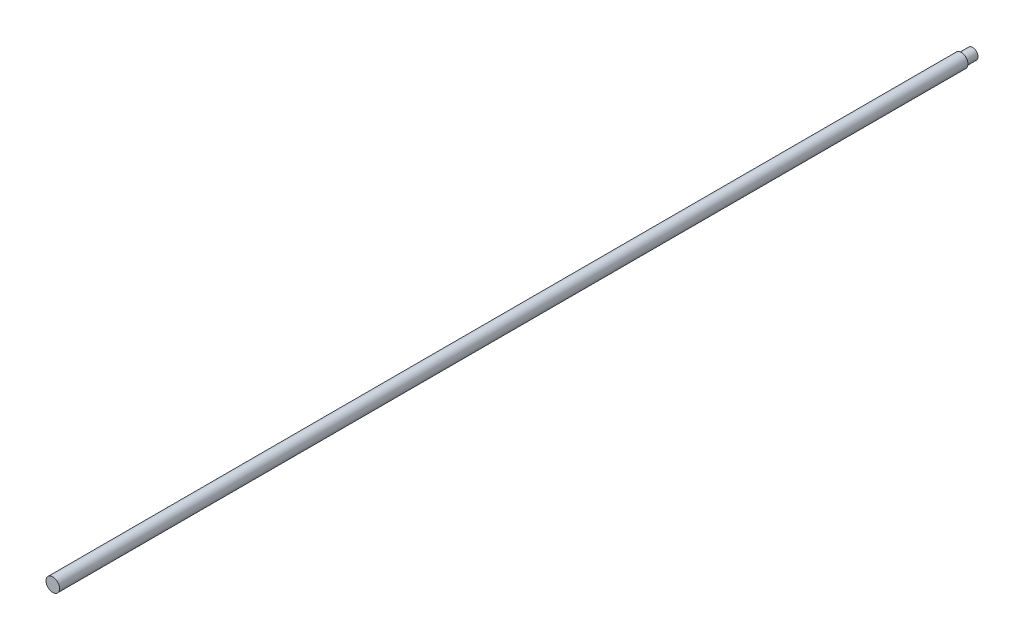
ISO-10303-21;
HEADER;
FILE_DESCRIPTION(('STEP AP214'),'2;1');
FILE_NAME('part.step','',(''),(''),'','','');
FILE_SCHEMA(('AUTOMOTIVE_DESIGN { 1 0 10303 214 1 1 1 1 }'));
ENDSEC;
DATA;
#1=APPLICATION_CONTEXT('core data for automotive mechanical design processes');
#2=APPLICATION_PROTOCOL_DEFINITION('international standard','automotive_design',2000,#1);
#3=PRODUCT_CONTEXT('',#1,'mechanical');
#4=PRODUCT('Part','Part','',(#3));
#5=PRODUCT_RELATED_PRODUCT_CATEGORY('part','',(#4));
#6=PRODUCT_DEFINITION_FORMATION('','',#4);
#7=PRODUCT_DEFINITION_CONTEXT('part definition',#1,'design');
#8=PRODUCT_DEFINITION('design','',#6,#7);
#9=PRODUCT_DEFINITION_SHAPE('','',#8);
#10=(LENGTH_UNIT() NAMED_UNIT(*) SI_UNIT(.MILLI.,.METRE.));
#11=(NAMED_UNIT(*) PLANE_ANGLE_UNIT() SI_UNIT($,.RADIAN.));
#12=(NAMED_UNIT(*) SI_UNIT($,.STERADIAN.) SOLID_ANGLE_UNIT());
#13=UNCERTAINTY_MEASURE_WITH_UNIT(LENGTH_MEASURE(1.E-05),#10,'distance_accuracy_value','');
#14=(GEOMETRIC_REPRESENTATION_CONTEXT(3) GLOBAL_UNCERTAINTY_ASSIGNED_CONTEXT((#13)) GLOBAL_UNIT_ASSIGNED_CONTEXT((#10,
#11,#12)) REPRESENTATION_CONTEXT('',''));
#15=CARTESIAN_POINT('',(0.,0.,0.));
#16=DIRECTION('',(0.,0.,1.));
#17=DIRECTION('',(1.,0.,0.));
#18=AXIS2_PLACEMENT_3D('',#15,#16,#17);
#19=CARTESIAN_POINT('',(0.,0.,340.));
#20=DIRECTION('',(0.,0.,-1.));
#21=DIRECTION('',(-1.,0.,0.));
#22=AXIS2_PLACEMENT_3D('',#19,#20,#21);
#23=CYLINDRICAL_SURFACE('',#22,2.5);
#24=CARTESIAN_POINT('',(0.,0.,340.));
#25=DIRECTION('',(0.,0.,1.));
#26=DIRECTION('',(1.,0.,0.));
#27=AXIS2_PLACEMENT_3D('',#24,#25,#26);
#28=CIRCLE('',#27,2.5);
#29=CARTESIAN_POINT('',(2.5,0.,340.));
#30=VERTEX_POINT('',#29);
#31=EDGE_CURVE('E12',#30,#30,#28,.T.);
#32=ORIENTED_EDGE('',*,*,#31,.F.);
#33=EDGE_LOOP('',(#32));
#34=FACE_BOUND('',#33,.T.);
#35=CARTESIAN_POINT('',(0.,0.,4.19999999999998));
#36=DIRECTION('',(0.,0.,-1.));
#37=DIRECTION('',(-1.,0.,0.));
#38=AXIS2_PLACEMENT_3D('',#35,#36,#37);
#39=CIRCLE('',#38,2.5);
#40=CARTESIAN_POINT('',(-2.5,0.,4.19999999999998));
#41=VERTEX_POINT('',#40);
#42=EDGE_CURVE('E44',#41,#41,#39,.T.);
#43=ORIENTED_EDGE('',*,*,#42,.F.);
#44=EDGE_LOOP('',(#43));
#45=FACE_BOUND('',#44,.T.);
#46=ADVANCED_FACE('F41',(#34,#45),#23,.T.);
#47=CARTESIAN_POINT('',(0.,0.,340.));
#48=DIRECTION('',(0.,0.,1.));
#49=DIRECTION('',(1.,0.,0.));
#50=AXIS2_PLACEMENT_3D('',#47,#48,#49);
#51=PLANE('',#50);
#52=ORIENTED_EDGE('',*,*,#31,.T.);
#53=EDGE_LOOP('',(#52));
#54=FACE_BOUND('',#53,.T.);
#55=ADVANCED_FACE('F78',(#54),#51,.T.);
#56=CARTESIAN_POINT('',(0.,0.,4.2));
#57=DIRECTION('',(0.,0.,-1.));
#58=DIRECTION('',(-1.,0.,0.));
#59=AXIS2_PLACEMENT_3D('',#56,#57,#58);
#60=PLANE('',#59);
#61=CARTESIAN_POINT('',(0.,0.,4.2));
#62=DIRECTION('',(0.,0.,-1.));
#63=DIRECTION('',(-1.,0.,0.));
#64=AXIS2_PLACEMENT_3D('',#61,#62,#63);
#65=CIRCLE('',#64,2.);
#66=CARTESIAN_POINT('',(-2.,0.,4.2));
#67=VERTEX_POINT('',#66);
#68=EDGE_CURVE('E64',#67,#67,#65,.T.);
#69=ORIENTED_EDGE('',*,*,#68,.F.);
#70=EDGE_LOOP('',(#69));
#71=FACE_BOUND('',#70,.T.);
#72=ORIENTED_EDGE('',*,*,#42,.T.);
#73=EDGE_LOOP('',(#72));
#74=FACE_BOUND('',#73,.T.);
#75=ADVANCED_FACE('F75',(#71,#74),#60,.T.);
#76=CARTESIAN_POINT('',(0.,0.,4.2));
#77=DIRECTION('',(0.,0.,-1.));
#78=DIRECTION('',(-1.,0.,0.));
#79=AXIS2_PLACEMENT_3D('',#76,#77,#78);
#80=CYLINDRICAL_SURFACE('',#79,2.);
#81=ORIENTED_EDGE('',*,*,#68,.T.);
#82=EDGE_LOOP('',(#81));
#83=FACE_BOUND('',#82,.T.);
#84=CARTESIAN_POINT('',(0.,0.,0.));
#85=DIRECTION('',(0.,0.,-1.));
#86=DIRECTION('',(-1.,0.,0.));
#87=AXIS2_PLACEMENT_3D('',#84,#85,#86);
#88=CIRCLE('',#87,2.);
#89=CARTESIAN_POINT('',(-2.,0.,0.));
#90=VERTEX_POINT('',#89);
#91=EDGE_CURVE('E60',#90,#90,#88,.T.);
#92=ORIENTED_EDGE('',*,*,#91,.F.);
#93=EDGE_LOOP('',(#92));
#94=FACE_BOUND('',#93,.T.);
#95=ADVANCED_FACE('F89',(#83,#94),#80,.T.);
#96=CARTESIAN_POINT('',(0.,0.,0.));
#97=DIRECTION('',(0.,0.,1.));
#98=DIRECTION('',(1.,0.,0.));
#99=AXIS2_PLACEMENT_3D('',#96,#97,#98);
#100=PLANE('',#99);
#101=CARTESIAN_POINT('',(0.,0.,0.));
#102=DIRECTION('',(0.,0.,-1.));
#103=DIRECTION('',(-1.,0.,0.));
#104=AXIS2_PLACEMENT_3D('',#101,#102,#103);
#105=CIRCLE('',#104,1.25);
#106=CARTESIAN_POINT('',(-1.25,0.,0.));
#107=VERTEX_POINT('',#106);
#108=EDGE_CURVE('E61',#107,#107,#105,.T.);
#109=ORIENTED_EDGE('',*,*,#108,.F.);
#110=EDGE_LOOP('',(#109));
#111=FACE_BOUND('',#110,.T.);
#112=ORIENTED_EDGE('',*,*,#91,.T.);
#113=EDGE_LOOP('',(#112));
#114=FACE_BOUND('',#113,.T.);
#115=ADVANCED_FACE('F54',(#111,#114),#100,.F.);
#116=CARTESIAN_POINT('',(0.,0.,8.5));
#117=DIRECTION('',(0.,0.,-1.));
#118=DIRECTION('',(-1.,0.,0.));
#119=AXIS2_PLACEMENT_3D('',#116,#117,#118);
#120=CONICAL_SURFACE('',#119,1.25,1.02974425867665);
#121=CARTESIAN_POINT('',(0.,0.,9.25107577378445));
#122=VERTEX_POINT('',#121);
#123=VERTEX_LOOP('',#122);
#124=FACE_BOUND('',#123,.T.);
#125=CARTESIAN_POINT('',(0.,0.,8.5));
#126=DIRECTION('',(0.,0.,-1.));
#127=DIRECTION('',(-1.,0.,0.));
#128=AXIS2_PLACEMENT_3D('',#125,#126,#127);
#129=CIRCLE('',#128,1.25);
#130=CARTESIAN_POINT('',(-1.25,0.,8.5));
#131=VERTEX_POINT('',#130);
#132=EDGE_CURVE('E58',#131,#131,#129,.T.);
#133=ORIENTED_EDGE('',*,*,#132,.T.);
#134=EDGE_LOOP('',(#133));
#135=FACE_BOUND('',#134,.T.);
#136=ADVANCED_FACE('F50',(#124,#135),#120,.F.);
#137=CARTESIAN_POINT('',(0.,0.,0.));
#138=DIRECTION('',(0.,0.,-1.));
#139=DIRECTION('',(-1.,0.,0.));
#140=AXIS2_PLACEMENT_3D('',#137,#138,#139);
#141=CYLINDRICAL_SURFACE('',#140,1.25);
#142=ORIENTED_EDGE('',*,*,#132,.F.);
#143=EDGE_LOOP('',(#142));
#144=FACE_BOUND('',#143,.T.);
#145=ORIENTED_EDGE('',*,*,#108,.T.);
#146=EDGE_LOOP('',(#145));
#147=FACE_BOUND('',#146,.T.);
#148=ADVANCED_FACE('F53',(#144,#147),#141,.F.);
#149=CLOSED_SHELL('',(#46,#55,#75,#95,#115,#136,#148));
#150=MANIFOLD_SOLID_BREP('B2',#149);
#151=ADVANCED_BREP_SHAPE_REPRESENTATION('',(#18,#150),#14);
#152=SHAPE_DEFINITION_REPRESENTATION(#9,#151);
ENDSEC;
END-ISO-10303-21;
